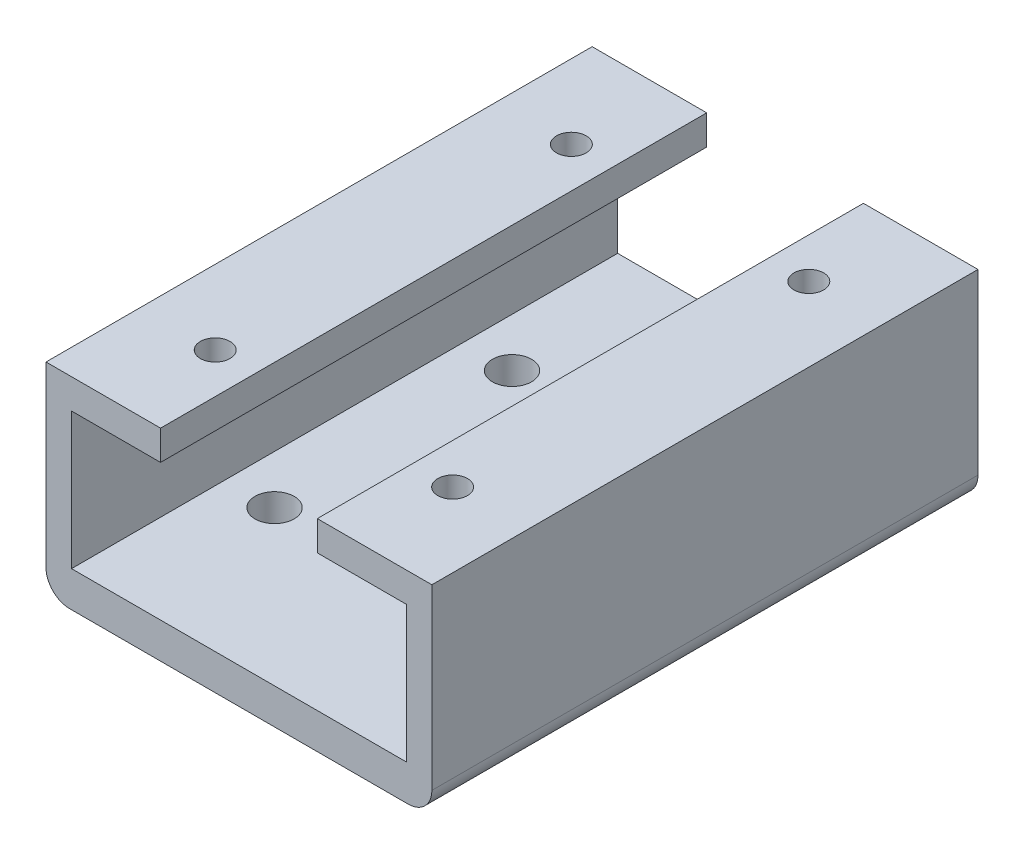
ISO-10303-21;
HEADER;
FILE_DESCRIPTION(('STEP AP214'),'2;1');
FILE_NAME('part.step','',(''),(''),'','','');
FILE_SCHEMA(('AUTOMOTIVE_DESIGN { 1 0 10303 214 1 1 1 1 }'));
ENDSEC;
DATA;
#1=APPLICATION_CONTEXT('core data for automotive mechanical design processes');
#2=APPLICATION_PROTOCOL_DEFINITION('international standard','automotive_design',2000,#1);
#3=PRODUCT_CONTEXT('',#1,'mechanical');
#4=PRODUCT('Part','Part','',(#3));
#5=PRODUCT_RELATED_PRODUCT_CATEGORY('part','',(#4));
#6=PRODUCT_DEFINITION_FORMATION('','',#4);
#7=PRODUCT_DEFINITION_CONTEXT('part definition',#1,'design');
#8=PRODUCT_DEFINITION('design','',#6,#7);
#9=PRODUCT_DEFINITION_SHAPE('','',#8);
#10=(LENGTH_UNIT() NAMED_UNIT(*) SI_UNIT(.MILLI.,.METRE.));
#11=(NAMED_UNIT(*) PLANE_ANGLE_UNIT() SI_UNIT($,.RADIAN.));
#12=(NAMED_UNIT(*) SI_UNIT($,.STERADIAN.) SOLID_ANGLE_UNIT());
#13=UNCERTAINTY_MEASURE_WITH_UNIT(LENGTH_MEASURE(1.E-05),#10,'distance_accuracy_value','');
#14=(GEOMETRIC_REPRESENTATION_CONTEXT(3) GLOBAL_UNCERTAINTY_ASSIGNED_CONTEXT((#13)) GLOBAL_UNIT_ASSIGNED_CONTEXT((#10,
#11,#12)) REPRESENTATION_CONTEXT('',''));
#15=CARTESIAN_POINT('',(0.,0.,0.));
#16=DIRECTION('',(0.,0.,1.));
#17=DIRECTION('',(1.,0.,0.));
#18=AXIS2_PLACEMENT_3D('',#15,#16,#17);
#19=CARTESIAN_POINT('',(16.25,17.,23.));
#20=DIRECTION('',(0.,0.,-1.));
#21=DIRECTION('',(-1.,0.,0.));
#22=AXIS2_PLACEMENT_3D('',#19,#20,#21);
#23=PLANE('',#22);
#24=DIRECTION('',(1.,0.,0.));
#25=VECTOR('',#24,1.);
#26=CARTESIAN_POINT('',(16.25,0.,23.));
#27=LINE('',#26,#25);
#28=CARTESIAN_POINT('',(-14.25,0.,23.));
#29=VERTEX_POINT('',#28);
#30=CARTESIAN_POINT('',(14.25,0.,23.));
#31=VERTEX_POINT('',#30);
#32=EDGE_CURVE('E198',#29,#31,#27,.T.);
#33=ORIENTED_EDGE('',*,*,#32,.T.);
#34=CARTESIAN_POINT('',(14.25,2.,23.));
#35=DIRECTION('',(0.,0.,-1.));
#36=DIRECTION('',(-1.,0.,0.));
#37=AXIS2_PLACEMENT_3D('',#34,#35,#36);
#38=CIRCLE('',#37,2.);
#39=CARTESIAN_POINT('',(16.25,2.,23.));
#40=VERTEX_POINT('',#39);
#41=EDGE_CURVE('E47',#31,#40,#38,.F.);
#42=ORIENTED_EDGE('',*,*,#41,.T.);
#43=DIRECTION('',(0.,-1.,0.));
#44=VECTOR('',#43,1.);
#45=CARTESIAN_POINT('',(16.25,17.,23.));
#46=LINE('',#45,#44);
#47=CARTESIAN_POINT('',(16.25,17.,23.));
#48=VERTEX_POINT('',#47);
#49=EDGE_CURVE('E233',#48,#40,#46,.T.);
#50=ORIENTED_EDGE('',*,*,#49,.F.);
#51=DIRECTION('',(1.,0.,0.));
#52=VECTOR('',#51,1.);
#53=CARTESIAN_POINT('',(16.25,17.,23.));
#54=LINE('',#53,#52);
#55=CARTESIAN_POINT('',(6.60000000000001,17.,23.));
#56=VERTEX_POINT('',#55);
#57=EDGE_CURVE('E166',#56,#48,#54,.T.);
#58=ORIENTED_EDGE('',*,*,#57,.F.);
#59=DIRECTION('',(0.,1.,0.));
#60=VECTOR('',#59,1.);
#61=CARTESIAN_POINT('',(6.60000000000001,0.,23.));
#62=LINE('',#61,#60);
#63=CARTESIAN_POINT('',(6.60000000000001,14.5,23.));
#64=VERTEX_POINT('',#63);
#65=EDGE_CURVE('E153',#64,#56,#62,.T.);
#66=ORIENTED_EDGE('',*,*,#65,.F.);
#67=DIRECTION('',(-1.,0.,0.));
#68=VECTOR('',#67,1.);
#69=CARTESIAN_POINT('',(0.,14.5,23.));
#70=LINE('',#69,#68);
#71=CARTESIAN_POINT('',(14.1,14.5,23.));
#72=VERTEX_POINT('',#71);
#73=EDGE_CURVE('E142',#72,#64,#70,.T.);
#74=ORIENTED_EDGE('',*,*,#73,.F.);
#75=DIRECTION('',(0.,1.,0.));
#76=VECTOR('',#75,1.);
#77=CARTESIAN_POINT('',(14.1,0.,23.));
#78=LINE('',#77,#76);
#79=CARTESIAN_POINT('',(14.1,3.,23.));
#80=VERTEX_POINT('',#79);
#81=EDGE_CURVE('E152',#80,#72,#78,.T.);
#82=ORIENTED_EDGE('',*,*,#81,.F.);
#83=DIRECTION('',(-1.,0.,0.));
#84=VECTOR('',#83,1.);
#85=CARTESIAN_POINT('',(0.,3.,23.));
#86=LINE('',#85,#84);
#87=CARTESIAN_POINT('',(-14.1,3.,23.));
#88=VERTEX_POINT('',#87);
#89=EDGE_CURVE('E176',#80,#88,#86,.T.);
#90=ORIENTED_EDGE('',*,*,#89,.T.);
#91=DIRECTION('',(0.,1.,0.));
#92=VECTOR('',#91,1.);
#93=CARTESIAN_POINT('',(-14.1,0.,23.));
#94=LINE('',#93,#92);
#95=CARTESIAN_POINT('',(-14.1,14.5,23.));
#96=VERTEX_POINT('',#95);
#97=EDGE_CURVE('E179',#88,#96,#94,.T.);
#98=ORIENTED_EDGE('',*,*,#97,.T.);
#99=CARTESIAN_POINT('',(-6.59999999999999,14.5,23.));
#100=VERTEX_POINT('',#99);
#101=EDGE_CURVE('E155',#100,#96,#70,.T.);
#102=ORIENTED_EDGE('',*,*,#101,.F.);
#103=DIRECTION('',(0.,1.,0.));
#104=VECTOR('',#103,1.);
#105=CARTESIAN_POINT('',(-6.59999999999999,0.,23.));
#106=LINE('',#105,#104);
#107=CARTESIAN_POINT('',(-6.59999999999999,17.,23.));
#108=VERTEX_POINT('',#107);
#109=EDGE_CURVE('E162',#100,#108,#106,.T.);
#110=ORIENTED_EDGE('',*,*,#109,.T.);
#111=CARTESIAN_POINT('',(-16.25,17.,23.));
#112=VERTEX_POINT('',#111);
#113=EDGE_CURVE('E215',#112,#108,#54,.T.);
#114=ORIENTED_EDGE('',*,*,#113,.F.);
#115=DIRECTION('',(0.,-1.,0.));
#116=VECTOR('',#115,1.);
#117=CARTESIAN_POINT('',(-16.25,17.,23.));
#118=LINE('',#117,#116);
#119=CARTESIAN_POINT('',(-16.25,2.,23.));
#120=VERTEX_POINT('',#119);
#121=EDGE_CURVE('E236',#112,#120,#118,.T.);
#122=ORIENTED_EDGE('',*,*,#121,.T.);
#123=CARTESIAN_POINT('',(-14.25,2.,23.));
#124=DIRECTION('',(0.,0.,-1.));
#125=DIRECTION('',(-1.,0.,0.));
#126=AXIS2_PLACEMENT_3D('',#123,#124,#125);
#127=CIRCLE('',#126,2.);
#128=EDGE_CURVE('E54',#120,#29,#127,.F.);
#129=ORIENTED_EDGE('',*,*,#128,.T.);
#130=EDGE_LOOP('',(#33,#42,#50,#58,#66,#74,#82,#90,#98,#102,#110,#114,#122,#129));
#131=FACE_BOUND('',#130,.T.);
#132=ADVANCED_FACE('F39',(#131),#23,.F.);
#133=CARTESIAN_POINT('',(16.25,17.,-23.));
#134=DIRECTION('',(0.,0.,1.));
#135=DIRECTION('',(1.,0.,0.));
#136=AXIS2_PLACEMENT_3D('',#133,#134,#135);
#137=PLANE('',#136);
#138=DIRECTION('',(0.,-1.,0.));
#139=VECTOR('',#138,1.);
#140=CARTESIAN_POINT('',(16.25,17.,-23.));
#141=LINE('',#140,#139);
#142=CARTESIAN_POINT('',(16.25,17.,-23.));
#143=VERTEX_POINT('',#142);
#144=CARTESIAN_POINT('',(16.25,2.,-23.));
#145=VERTEX_POINT('',#144);
#146=EDGE_CURVE('E230',#143,#145,#141,.T.);
#147=ORIENTED_EDGE('',*,*,#146,.T.);
#148=CARTESIAN_POINT('',(14.25,2.,-23.));
#149=DIRECTION('',(0.,0.,1.));
#150=DIRECTION('',(1.,0.,0.));
#151=AXIS2_PLACEMENT_3D('',#148,#149,#150);
#152=CIRCLE('',#151,2.);
#153=CARTESIAN_POINT('',(14.25,0.,-23.));
#154=VERTEX_POINT('',#153);
#155=EDGE_CURVE('E244',#145,#154,#152,.F.);
#156=ORIENTED_EDGE('',*,*,#155,.T.);
#157=DIRECTION('',(-1.,0.,0.));
#158=VECTOR('',#157,1.);
#159=CARTESIAN_POINT('',(16.25,0.,-23.));
#160=LINE('',#159,#158);
#161=CARTESIAN_POINT('',(-14.25,0.,-23.));
#162=VERTEX_POINT('',#161);
#163=EDGE_CURVE('E214',#154,#162,#160,.T.);
#164=ORIENTED_EDGE('',*,*,#163,.T.);
#165=CARTESIAN_POINT('',(-14.25,2.,-23.));
#166=DIRECTION('',(0.,0.,1.));
#167=DIRECTION('',(1.,0.,0.));
#168=AXIS2_PLACEMENT_3D('',#165,#166,#167);
#169=CIRCLE('',#168,2.);
#170=CARTESIAN_POINT('',(-16.25,2.,-23.));
#171=VERTEX_POINT('',#170);
#172=EDGE_CURVE('E242',#162,#171,#169,.F.);
#173=ORIENTED_EDGE('',*,*,#172,.T.);
#174=DIRECTION('',(0.,-1.,0.));
#175=VECTOR('',#174,1.);
#176=CARTESIAN_POINT('',(-16.25,17.,-23.));
#177=LINE('',#176,#175);
#178=CARTESIAN_POINT('',(-16.25,17.,-23.));
#179=VERTEX_POINT('',#178);
#180=EDGE_CURVE('E224',#179,#171,#177,.T.);
#181=ORIENTED_EDGE('',*,*,#180,.F.);
#182=DIRECTION('',(-1.,0.,0.));
#183=VECTOR('',#182,1.);
#184=CARTESIAN_POINT('',(16.25,17.,-23.));
#185=LINE('',#184,#183);
#186=CARTESIAN_POINT('',(-6.6,17.,-23.));
#187=VERTEX_POINT('',#186);
#188=EDGE_CURVE('E220',#187,#179,#185,.T.);
#189=ORIENTED_EDGE('',*,*,#188,.F.);
#190=DIRECTION('',(0.,1.,0.));
#191=VECTOR('',#190,1.);
#192=CARTESIAN_POINT('',(-6.6,0.,-23.));
#193=LINE('',#192,#191);
#194=CARTESIAN_POINT('',(-6.6,14.5,-23.));
#195=VERTEX_POINT('',#194);
#196=EDGE_CURVE('E167',#195,#187,#193,.T.);
#197=ORIENTED_EDGE('',*,*,#196,.F.);
#198=DIRECTION('',(-1.,0.,0.));
#199=VECTOR('',#198,1.);
#200=CARTESIAN_POINT('',(0.,14.5,-23.));
#201=LINE('',#200,#199);
#202=CARTESIAN_POINT('',(-14.1,14.5,-23.));
#203=VERTEX_POINT('',#202);
#204=EDGE_CURVE('E169',#195,#203,#201,.T.);
#205=ORIENTED_EDGE('',*,*,#204,.T.);
#206=DIRECTION('',(0.,1.,0.));
#207=VECTOR('',#206,1.);
#208=CARTESIAN_POINT('',(-14.1,0.,-23.));
#209=LINE('',#208,#207);
#210=CARTESIAN_POINT('',(-14.1,3.,-23.));
#211=VERTEX_POINT('',#210);
#212=EDGE_CURVE('E193',#211,#203,#209,.T.);
#213=ORIENTED_EDGE('',*,*,#212,.F.);
#214=DIRECTION('',(-1.,0.,0.));
#215=VECTOR('',#214,1.);
#216=CARTESIAN_POINT('',(0.,3.,-23.));
#217=LINE('',#216,#215);
#218=CARTESIAN_POINT('',(14.1,3.,-23.));
#219=VERTEX_POINT('',#218);
#220=EDGE_CURVE('E190',#219,#211,#217,.T.);
#221=ORIENTED_EDGE('',*,*,#220,.F.);
#222=DIRECTION('',(0.,1.,0.));
#223=VECTOR('',#222,1.);
#224=CARTESIAN_POINT('',(14.1,0.,-23.));
#225=LINE('',#224,#223);
#226=CARTESIAN_POINT('',(14.1,14.5,-23.));
#227=VERTEX_POINT('',#226);
#228=EDGE_CURVE('E187',#219,#227,#225,.T.);
#229=ORIENTED_EDGE('',*,*,#228,.T.);
#230=CARTESIAN_POINT('',(6.6,14.5,-23.));
#231=VERTEX_POINT('',#230);
#232=EDGE_CURVE('E185',#227,#231,#201,.T.);
#233=ORIENTED_EDGE('',*,*,#232,.T.);
#234=DIRECTION('',(0.,1.,0.));
#235=VECTOR('',#234,1.);
#236=CARTESIAN_POINT('',(6.6,0.,-23.));
#237=LINE('',#236,#235);
#238=CARTESIAN_POINT('',(6.6,17.,-23.));
#239=VERTEX_POINT('',#238);
#240=EDGE_CURVE('E160',#231,#239,#237,.T.);
#241=ORIENTED_EDGE('',*,*,#240,.T.);
#242=EDGE_CURVE('E221',#143,#239,#185,.T.);
#243=ORIENTED_EDGE('',*,*,#242,.F.);
#244=EDGE_LOOP('',(#147,#156,#164,#173,#181,#189,#197,#205,#213,#221,#229,#233,#241,#243));
#245=FACE_BOUND('',#244,.T.);
#246=ADVANCED_FACE('F258',(#245),#137,.F.);
#247=CARTESIAN_POINT('',(0.,17.,0.));
#248=DIRECTION('',(0.,1.,0.));
#249=DIRECTION('',(0.,0.,1.));
#250=AXIS2_PLACEMENT_3D('',#247,#248,#249);
#251=PLANE('',#250);
#252=CARTESIAN_POINT('',(10.,17.,15.));
#253=DIRECTION('',(0.,1.,0.));
#254=DIRECTION('',(0.,0.,1.));
#255=AXIS2_PLACEMENT_3D('',#252,#253,#254);
#256=CIRCLE('',#255,1.25);
#257=CARTESIAN_POINT('',(10.,17.,16.25));
#258=VERTEX_POINT('',#257);
#259=EDGE_CURVE('E426',#258,#258,#256,.T.);
#260=ORIENTED_EDGE('',*,*,#259,.F.);
#261=EDGE_LOOP('',(#260));
#262=FACE_BOUND('',#261,.T.);
#263=CARTESIAN_POINT('',(10.,17.,-15.));
#264=DIRECTION('',(0.,1.,0.));
#265=DIRECTION('',(0.,0.,1.));
#266=AXIS2_PLACEMENT_3D('',#263,#264,#265);
#267=CIRCLE('',#266,1.25);
#268=CARTESIAN_POINT('',(10.,17.,-13.75));
#269=VERTEX_POINT('',#268);
#270=EDGE_CURVE('E415',#269,#269,#267,.T.);
#271=ORIENTED_EDGE('',*,*,#270,.F.);
#272=EDGE_LOOP('',(#271));
#273=FACE_BOUND('',#272,.T.);
#274=ORIENTED_EDGE('',*,*,#242,.T.);
#275=DIRECTION('',(0.,0.,-1.));
#276=VECTOR('',#275,1.);
#277=CARTESIAN_POINT('',(6.60000000000001,17.,23.));
#278=LINE('',#277,#276);
#279=EDGE_CURVE('E196',#56,#239,#278,.T.);
#280=ORIENTED_EDGE('',*,*,#279,.F.);
#281=ORIENTED_EDGE('',*,*,#57,.T.);
#282=DIRECTION('',(0.,0.,-1.));
#283=VECTOR('',#282,1.);
#284=CARTESIAN_POINT('',(16.25,17.,23.));
#285=LINE('',#284,#283);
#286=EDGE_CURVE('E218',#48,#143,#285,.T.);
#287=ORIENTED_EDGE('',*,*,#286,.T.);
#288=EDGE_LOOP('',(#274,#280,#281,#287));
#289=FACE_BOUND('',#288,.T.);
#290=ADVANCED_FACE('F292',(#262,#273,#289),#251,.T.);
#291=CARTESIAN_POINT('',(-16.25,17.,23.));
#292=DIRECTION('',(1.,0.,0.));
#293=DIRECTION('',(0.,0.,-1.));
#294=AXIS2_PLACEMENT_3D('',#291,#292,#293);
#295=PLANE('',#294);
#296=ORIENTED_EDGE('',*,*,#180,.T.);
#297=DIRECTION('',(0.,0.,1.));
#298=VECTOR('',#297,1.);
#299=CARTESIAN_POINT('',(-16.25,2.,23.));
#300=LINE('',#299,#298);
#301=EDGE_CURVE('E11',#171,#120,#300,.T.);
#302=ORIENTED_EDGE('',*,*,#301,.T.);
#303=ORIENTED_EDGE('',*,*,#121,.F.);
#304=DIRECTION('',(0.,0.,1.));
#305=VECTOR('',#304,1.);
#306=CARTESIAN_POINT('',(-16.25,17.,23.));
#307=LINE('',#306,#305);
#308=EDGE_CURVE('E211',#179,#112,#307,.T.);
#309=ORIENTED_EDGE('',*,*,#308,.F.);
#310=EDGE_LOOP('',(#296,#302,#303,#309));
#311=FACE_BOUND('',#310,.T.);
#312=ADVANCED_FACE('F266',(#311),#295,.F.);
#313=CARTESIAN_POINT('',(16.25,17.,23.));
#314=DIRECTION('',(-1.,0.,0.));
#315=DIRECTION('',(0.,0.,1.));
#316=AXIS2_PLACEMENT_3D('',#313,#314,#315);
#317=PLANE('',#316);
#318=ORIENTED_EDGE('',*,*,#49,.T.);
#319=DIRECTION('',(0.,0.,-1.));
#320=VECTOR('',#319,1.);
#321=CARTESIAN_POINT('',(16.25,2.,23.));
#322=LINE('',#321,#320);
#323=EDGE_CURVE('E239',#40,#145,#322,.T.);
#324=ORIENTED_EDGE('',*,*,#323,.T.);
#325=ORIENTED_EDGE('',*,*,#146,.F.);
#326=ORIENTED_EDGE('',*,*,#286,.F.);
#327=EDGE_LOOP('',(#318,#324,#325,#326));
#328=FACE_BOUND('',#327,.T.);
#329=ADVANCED_FACE('F254',(#328),#317,.F.);
#330=CARTESIAN_POINT('',(-10.,17.,15.));
#331=DIRECTION('',(0.,1.,0.));
#332=DIRECTION('',(0.,0.,1.));
#333=AXIS2_PLACEMENT_3D('',#330,#331,#332);
#334=CIRCLE('',#333,1.25);
#335=CARTESIAN_POINT('',(-10.,17.,16.25));
#336=VERTEX_POINT('',#335);
#337=EDGE_CURVE('E421',#336,#336,#334,.T.);
#338=ORIENTED_EDGE('',*,*,#337,.F.);
#339=EDGE_LOOP('',(#338));
#340=FACE_BOUND('',#339,.T.);
#341=CARTESIAN_POINT('',(-10.,17.,-15.));
#342=DIRECTION('',(0.,1.,0.));
#343=DIRECTION('',(0.,0.,1.));
#344=AXIS2_PLACEMENT_3D('',#341,#342,#343);
#345=CIRCLE('',#344,1.25);
#346=CARTESIAN_POINT('',(-10.,17.,-13.75));
#347=VERTEX_POINT('',#346);
#348=EDGE_CURVE('E412',#347,#347,#345,.T.);
#349=ORIENTED_EDGE('',*,*,#348,.F.);
#350=EDGE_LOOP('',(#349));
#351=FACE_BOUND('',#350,.T.);
#352=DIRECTION('',(0.,0.,-1.));
#353=VECTOR('',#352,1.);
#354=CARTESIAN_POINT('',(-6.59999999999999,17.,23.));
#355=LINE('',#354,#353);
#356=EDGE_CURVE('E199',#108,#187,#355,.T.);
#357=ORIENTED_EDGE('',*,*,#356,.T.);
#358=ORIENTED_EDGE('',*,*,#188,.T.);
#359=ORIENTED_EDGE('',*,*,#308,.T.);
#360=ORIENTED_EDGE('',*,*,#113,.T.);
#361=EDGE_LOOP('',(#357,#358,#359,#360));
#362=FACE_BOUND('',#361,.T.);
#363=ADVANCED_FACE('F269',(#340,#351,#362),#251,.T.);
#364=CARTESIAN_POINT('',(0.,0.,0.));
#365=DIRECTION('',(0.,1.,0.));
#366=DIRECTION('',(0.,0.,1.));
#367=AXIS2_PLACEMENT_3D('',#364,#365,#366);
#368=PLANE('',#367);
#369=CARTESIAN_POINT('',(-10.,0.,-10.));
#370=DIRECTION('',(0.,-1.,0.));
#371=DIRECTION('',(0.,0.,-1.));
#372=AXIS2_PLACEMENT_3D('',#369,#370,#371);
#373=CIRCLE('',#372,1.65);
#374=CARTESIAN_POINT('',(-10.,0.,-11.65));
#375=VERTEX_POINT('',#374);
#376=EDGE_CURVE('E385',#375,#375,#373,.T.);
#377=ORIENTED_EDGE('',*,*,#376,.F.);
#378=EDGE_LOOP('',(#377));
#379=FACE_BOUND('',#378,.T.);
#380=CARTESIAN_POINT('',(10.,0.,-10.));
#381=DIRECTION('',(0.,-1.,0.));
#382=DIRECTION('',(0.,0.,-1.));
#383=AXIS2_PLACEMENT_3D('',#380,#381,#382);
#384=CIRCLE('',#383,1.65);
#385=CARTESIAN_POINT('',(10.,0.,-11.65));
#386=VERTEX_POINT('',#385);
#387=EDGE_CURVE('E389',#386,#386,#384,.T.);
#388=ORIENTED_EDGE('',*,*,#387,.F.);
#389=EDGE_LOOP('',(#388));
#390=FACE_BOUND('',#389,.T.);
#391=CARTESIAN_POINT('',(10.,0.,10.));
#392=DIRECTION('',(0.,-1.,0.));
#393=DIRECTION('',(0.,0.,-1.));
#394=AXIS2_PLACEMENT_3D('',#391,#392,#393);
#395=CIRCLE('',#394,1.65);
#396=CARTESIAN_POINT('',(10.,0.,8.35));
#397=VERTEX_POINT('',#396);
#398=EDGE_CURVE('E393',#397,#397,#395,.T.);
#399=ORIENTED_EDGE('',*,*,#398,.F.);
#400=EDGE_LOOP('',(#399));
#401=FACE_BOUND('',#400,.T.);
#402=CARTESIAN_POINT('',(-10.,0.,10.));
#403=DIRECTION('',(0.,-1.,0.));
#404=DIRECTION('',(0.,0.,-1.));
#405=AXIS2_PLACEMENT_3D('',#402,#403,#404);
#406=CIRCLE('',#405,1.65);
#407=CARTESIAN_POINT('',(-10.,0.,8.35));
#408=VERTEX_POINT('',#407);
#409=EDGE_CURVE('E396',#408,#408,#406,.T.);
#410=ORIENTED_EDGE('',*,*,#409,.F.);
#411=EDGE_LOOP('',(#410));
#412=FACE_BOUND('',#411,.T.);
#413=ORIENTED_EDGE('',*,*,#163,.F.);
#414=DIRECTION('',(0.,0.,-1.));
#415=VECTOR('',#414,1.);
#416=CARTESIAN_POINT('',(14.25,0.,0.));
#417=LINE('',#416,#415);
#418=EDGE_CURVE('E61',#154,#31,#417,.F.);
#419=ORIENTED_EDGE('',*,*,#418,.T.);
#420=ORIENTED_EDGE('',*,*,#32,.F.);
#421=DIRECTION('',(0.,0.,1.));
#422=VECTOR('',#421,1.);
#423=CARTESIAN_POINT('',(-14.25,0.,0.));
#424=LINE('',#423,#422);
#425=EDGE_CURVE('E246',#29,#162,#424,.F.);
#426=ORIENTED_EDGE('',*,*,#425,.T.);
#427=EDGE_LOOP('',(#413,#419,#420,#426));
#428=FACE_BOUND('',#427,.T.);
#429=ADVANCED_FACE('F261',(#379,#390,#401,#412,#428),#368,.F.);
#430=CARTESIAN_POINT('',(6.60000000000001,0.,23.));
#431=DIRECTION('',(-1.,0.,0.));
#432=DIRECTION('',(0.,0.,1.));
#433=AXIS2_PLACEMENT_3D('',#430,#431,#432);
#434=PLANE('',#433);
#435=ORIENTED_EDGE('',*,*,#240,.F.);
#436=DIRECTION('',(0.,0.,-1.));
#437=VECTOR('',#436,1.);
#438=CARTESIAN_POINT('',(6.60000000000001,14.5,23.));
#439=LINE('',#438,#437);
#440=EDGE_CURVE('E146',#64,#231,#439,.T.);
#441=ORIENTED_EDGE('',*,*,#440,.F.);
#442=ORIENTED_EDGE('',*,*,#65,.T.);
#443=ORIENTED_EDGE('',*,*,#279,.T.);
#444=EDGE_LOOP('',(#435,#441,#442,#443));
#445=FACE_BOUND('',#444,.T.);
#446=ADVANCED_FACE('F157',(#445),#434,.T.);
#447=CARTESIAN_POINT('',(-6.59999999999999,0.,23.));
#448=DIRECTION('',(-1.,0.,0.));
#449=DIRECTION('',(0.,0.,1.));
#450=AXIS2_PLACEMENT_3D('',#447,#448,#449);
#451=PLANE('',#450);
#452=ORIENTED_EDGE('',*,*,#196,.T.);
#453=ORIENTED_EDGE('',*,*,#356,.F.);
#454=ORIENTED_EDGE('',*,*,#109,.F.);
#455=DIRECTION('',(0.,0.,-1.));
#456=VECTOR('',#455,1.);
#457=CARTESIAN_POINT('',(-6.59999999999999,14.5,23.));
#458=LINE('',#457,#456);
#459=EDGE_CURVE('E202',#100,#195,#458,.T.);
#460=ORIENTED_EDGE('',*,*,#459,.T.);
#461=EDGE_LOOP('',(#452,#453,#454,#460));
#462=FACE_BOUND('',#461,.T.);
#463=ADVANCED_FACE('F275',(#462),#451,.F.);
#464=CARTESIAN_POINT('',(0.,14.5,23.));
#465=DIRECTION('',(0.,-1.,0.));
#466=DIRECTION('',(0.,0.,-1.));
#467=AXIS2_PLACEMENT_3D('',#464,#465,#466);
#468=PLANE('',#467);
#469=ORIENTED_EDGE('',*,*,#204,.F.);
#470=ORIENTED_EDGE('',*,*,#459,.F.);
#471=ORIENTED_EDGE('',*,*,#101,.T.);
#472=DIRECTION('',(0.,0.,-1.));
#473=VECTOR('',#472,1.);
#474=CARTESIAN_POINT('',(-14.1,14.5,23.));
#475=LINE('',#474,#473);
#476=EDGE_CURVE('E204',#96,#203,#475,.T.);
#477=ORIENTED_EDGE('',*,*,#476,.T.);
#478=EDGE_LOOP('',(#469,#470,#471,#477));
#479=FACE_BOUND('',#478,.T.);
#480=ADVANCED_FACE('F279',(#479),#468,.T.);
#481=CARTESIAN_POINT('',(-14.1,0.,23.));
#482=DIRECTION('',(-1.,0.,0.));
#483=DIRECTION('',(0.,0.,1.));
#484=AXIS2_PLACEMENT_3D('',#481,#482,#483);
#485=PLANE('',#484);
#486=ORIENTED_EDGE('',*,*,#212,.T.);
#487=ORIENTED_EDGE('',*,*,#476,.F.);
#488=ORIENTED_EDGE('',*,*,#97,.F.);
#489=DIRECTION('',(0.,0.,-1.));
#490=VECTOR('',#489,1.);
#491=CARTESIAN_POINT('',(-14.1,3.,23.));
#492=LINE('',#491,#490);
#493=EDGE_CURVE('E206',#88,#211,#492,.T.);
#494=ORIENTED_EDGE('',*,*,#493,.T.);
#495=EDGE_LOOP('',(#486,#487,#488,#494));
#496=FACE_BOUND('',#495,.T.);
#497=ADVANCED_FACE('F283',(#496),#485,.F.);
#498=CARTESIAN_POINT('',(0.,3.,23.));
#499=DIRECTION('',(0.,-1.,0.));
#500=DIRECTION('',(0.,0.,-1.));
#501=AXIS2_PLACEMENT_3D('',#498,#499,#500);
#502=PLANE('',#501);
#503=CARTESIAN_POINT('',(-10.,3.,-10.));
#504=DIRECTION('',(0.,-1.,0.));
#505=DIRECTION('',(0.,0.,-1.));
#506=AXIS2_PLACEMENT_3D('',#503,#504,#505);
#507=CIRCLE('',#506,1.65);
#508=CARTESIAN_POINT('',(-10.,3.,-11.65));
#509=VERTEX_POINT('',#508);
#510=EDGE_CURVE('E403',#509,#509,#507,.F.);
#511=ORIENTED_EDGE('',*,*,#510,.F.);
#512=EDGE_LOOP('',(#511));
#513=FACE_BOUND('',#512,.T.);
#514=CARTESIAN_POINT('',(10.,3.,-10.));
#515=DIRECTION('',(0.,-1.,0.));
#516=DIRECTION('',(0.,0.,-1.));
#517=AXIS2_PLACEMENT_3D('',#514,#515,#516);
#518=CIRCLE('',#517,1.65);
#519=CARTESIAN_POINT('',(10.,3.,-11.65));
#520=VERTEX_POINT('',#519);
#521=EDGE_CURVE('E402',#520,#520,#518,.F.);
#522=ORIENTED_EDGE('',*,*,#521,.F.);
#523=EDGE_LOOP('',(#522));
#524=FACE_BOUND('',#523,.T.);
#525=CARTESIAN_POINT('',(10.,3.,10.));
#526=DIRECTION('',(0.,-1.,0.));
#527=DIRECTION('',(0.,0.,-1.));
#528=AXIS2_PLACEMENT_3D('',#525,#526,#527);
#529=CIRCLE('',#528,1.65);
#530=CARTESIAN_POINT('',(10.,3.,8.35));
#531=VERTEX_POINT('',#530);
#532=EDGE_CURVE('E398',#531,#531,#529,.F.);
#533=ORIENTED_EDGE('',*,*,#532,.F.);
#534=EDGE_LOOP('',(#533));
#535=FACE_BOUND('',#534,.T.);
#536=CARTESIAN_POINT('',(-10.,3.,10.));
#537=DIRECTION('',(0.,-1.,0.));
#538=DIRECTION('',(0.,0.,-1.));
#539=AXIS2_PLACEMENT_3D('',#536,#537,#538);
#540=CIRCLE('',#539,1.65);
#541=CARTESIAN_POINT('',(-10.,3.,8.35));
#542=VERTEX_POINT('',#541);
#543=EDGE_CURVE('E172',#542,#542,#540,.F.);
#544=ORIENTED_EDGE('',*,*,#543,.F.);
#545=EDGE_LOOP('',(#544));
#546=FACE_BOUND('',#545,.T.);
#547=ORIENTED_EDGE('',*,*,#220,.T.);
#548=ORIENTED_EDGE('',*,*,#493,.F.);
#549=ORIENTED_EDGE('',*,*,#89,.F.);
#550=DIRECTION('',(0.,0.,-1.));
#551=VECTOR('',#550,1.);
#552=CARTESIAN_POINT('',(14.1,3.,23.));
#553=LINE('',#552,#551);
#554=EDGE_CURVE('E208',#80,#219,#553,.T.);
#555=ORIENTED_EDGE('',*,*,#554,.T.);
#556=EDGE_LOOP('',(#547,#548,#549,#555));
#557=FACE_BOUND('',#556,.T.);
#558=ADVANCED_FACE('F287',(#513,#524,#535,#546,#557),#502,.F.);
#559=CARTESIAN_POINT('',(14.1,0.,23.));
#560=DIRECTION('',(-1.,0.,0.));
#561=DIRECTION('',(0.,0.,1.));
#562=AXIS2_PLACEMENT_3D('',#559,#560,#561);
#563=PLANE('',#562);
#564=ORIENTED_EDGE('',*,*,#228,.F.);
#565=ORIENTED_EDGE('',*,*,#554,.F.);
#566=ORIENTED_EDGE('',*,*,#81,.T.);
#567=DIRECTION('',(0.,0.,-1.));
#568=VECTOR('',#567,1.);
#569=CARTESIAN_POINT('',(14.1,14.5,23.));
#570=LINE('',#569,#568);
#571=EDGE_CURVE('E148',#72,#227,#570,.T.);
#572=ORIENTED_EDGE('',*,*,#571,.T.);
#573=EDGE_LOOP('',(#564,#565,#566,#572));
#574=FACE_BOUND('',#573,.T.);
#575=ADVANCED_FACE('F290',(#574),#563,.T.);
#576=ORIENTED_EDGE('',*,*,#232,.F.);
#577=ORIENTED_EDGE('',*,*,#571,.F.);
#578=ORIENTED_EDGE('',*,*,#73,.T.);
#579=ORIENTED_EDGE('',*,*,#440,.T.);
#580=EDGE_LOOP('',(#576,#577,#578,#579));
#581=FACE_BOUND('',#580,.T.);
#582=ADVANCED_FACE('F145',(#581),#468,.T.);
#583=CARTESIAN_POINT('',(-10.,17.001,10.));
#584=DIRECTION('',(0.,-1.,0.));
#585=DIRECTION('',(0.,0.,-1.));
#586=AXIS2_PLACEMENT_3D('',#583,#584,#585);
#587=CYLINDRICAL_SURFACE('',#586,1.65);
#588=ORIENTED_EDGE('',*,*,#409,.T.);
#589=EDGE_LOOP('',(#588));
#590=FACE_BOUND('',#589,.T.);
#591=ORIENTED_EDGE('',*,*,#543,.T.);
#592=EDGE_LOOP('',(#591));
#593=FACE_BOUND('',#592,.T.);
#594=ADVANCED_FACE('F355',(#590,#593),#587,.F.);
#595=CARTESIAN_POINT('',(10.,17.001,10.));
#596=DIRECTION('',(0.,-1.,0.));
#597=DIRECTION('',(0.,0.,-1.));
#598=AXIS2_PLACEMENT_3D('',#595,#596,#597);
#599=CYLINDRICAL_SURFACE('',#598,1.65);
#600=ORIENTED_EDGE('',*,*,#398,.T.);
#601=EDGE_LOOP('',(#600));
#602=FACE_BOUND('',#601,.T.);
#603=ORIENTED_EDGE('',*,*,#532,.T.);
#604=EDGE_LOOP('',(#603));
#605=FACE_BOUND('',#604,.T.);
#606=ADVANCED_FACE('F351',(#602,#605),#599,.F.);
#607=CARTESIAN_POINT('',(10.,17.001,-10.));
#608=DIRECTION('',(0.,-1.,0.));
#609=DIRECTION('',(0.,0.,-1.));
#610=AXIS2_PLACEMENT_3D('',#607,#608,#609);
#611=CYLINDRICAL_SURFACE('',#610,1.65);
#612=ORIENTED_EDGE('',*,*,#387,.T.);
#613=EDGE_LOOP('',(#612));
#614=FACE_BOUND('',#613,.T.);
#615=ORIENTED_EDGE('',*,*,#521,.T.);
#616=EDGE_LOOP('',(#615));
#617=FACE_BOUND('',#616,.T.);
#618=ADVANCED_FACE('F354',(#614,#617),#611,.F.);
#619=CARTESIAN_POINT('',(-10.,17.001,-10.));
#620=DIRECTION('',(0.,-1.,0.));
#621=DIRECTION('',(0.,0.,-1.));
#622=AXIS2_PLACEMENT_3D('',#619,#620,#621);
#623=CYLINDRICAL_SURFACE('',#622,1.65);
#624=ORIENTED_EDGE('',*,*,#376,.T.);
#625=EDGE_LOOP('',(#624));
#626=FACE_BOUND('',#625,.T.);
#627=ORIENTED_EDGE('',*,*,#510,.T.);
#628=EDGE_LOOP('',(#627));
#629=FACE_BOUND('',#628,.T.);
#630=ADVANCED_FACE('F349',(#626,#629),#623,.F.);
#631=CARTESIAN_POINT('',(-10.,15.,-15.));
#632=DIRECTION('',(0.,1.,0.));
#633=DIRECTION('',(0.,0.,1.));
#634=AXIS2_PLACEMENT_3D('',#631,#632,#633);
#635=CYLINDRICAL_SURFACE('',#634,1.25);
#636=CARTESIAN_POINT('',(-10.,15.,-15.));
#637=DIRECTION('',(0.,1.,0.));
#638=DIRECTION('',(0.,0.,1.));
#639=AXIS2_PLACEMENT_3D('',#636,#637,#638);
#640=CIRCLE('',#639,1.25);
#641=CARTESIAN_POINT('',(-10.,15.,-13.75));
#642=VERTEX_POINT('',#641);
#643=EDGE_CURVE('E406',#642,#642,#640,.T.);
#644=ORIENTED_EDGE('',*,*,#643,.F.);
#645=EDGE_LOOP('',(#644));
#646=FACE_BOUND('',#645,.T.);
#647=ORIENTED_EDGE('',*,*,#348,.T.);
#648=EDGE_LOOP('',(#647));
#649=FACE_BOUND('',#648,.T.);
#650=ADVANCED_FACE('F345',(#646,#649),#635,.F.);
#651=CARTESIAN_POINT('',(-10.,15.,-15.));
#652=DIRECTION('',(0.,1.,0.));
#653=DIRECTION('',(0.,0.,1.));
#654=AXIS2_PLACEMENT_3D('',#651,#652,#653);
#655=PLANE('',#654);
#656=ORIENTED_EDGE('',*,*,#643,.T.);
#657=EDGE_LOOP('',(#656));
#658=FACE_BOUND('',#657,.T.);
#659=ADVANCED_FACE('F337',(#658),#655,.T.);
#660=CARTESIAN_POINT('',(-10.,15.,15.));
#661=DIRECTION('',(0.,1.,0.));
#662=DIRECTION('',(0.,0.,1.));
#663=AXIS2_PLACEMENT_3D('',#660,#661,#662);
#664=CYLINDRICAL_SURFACE('',#663,1.25);
#665=CARTESIAN_POINT('',(-10.,15.,15.));
#666=DIRECTION('',(0.,1.,0.));
#667=DIRECTION('',(0.,0.,1.));
#668=AXIS2_PLACEMENT_3D('',#665,#666,#667);
#669=CIRCLE('',#668,1.25);
#670=CARTESIAN_POINT('',(-10.,15.,16.25));
#671=VERTEX_POINT('',#670);
#672=EDGE_CURVE('E418',#671,#671,#669,.T.);
#673=ORIENTED_EDGE('',*,*,#672,.F.);
#674=EDGE_LOOP('',(#673));
#675=FACE_BOUND('',#674,.T.);
#676=ORIENTED_EDGE('',*,*,#337,.T.);
#677=EDGE_LOOP('',(#676));
#678=FACE_BOUND('',#677,.T.);
#679=ADVANCED_FACE('F333',(#675,#678),#664,.F.);
#680=CARTESIAN_POINT('',(-10.,15.,15.));
#681=DIRECTION('',(0.,1.,0.));
#682=DIRECTION('',(0.,0.,1.));
#683=AXIS2_PLACEMENT_3D('',#680,#681,#682);
#684=PLANE('',#683);
#685=ORIENTED_EDGE('',*,*,#672,.T.);
#686=EDGE_LOOP('',(#685));
#687=FACE_BOUND('',#686,.T.);
#688=ADVANCED_FACE('F336',(#687),#684,.T.);
#689=CARTESIAN_POINT('',(10.,15.,-15.));
#690=DIRECTION('',(0.,1.,0.));
#691=DIRECTION('',(0.,0.,1.));
#692=AXIS2_PLACEMENT_3D('',#689,#690,#691);
#693=CYLINDRICAL_SURFACE('',#692,1.25);
#694=CARTESIAN_POINT('',(10.,15.,-15.));
#695=DIRECTION('',(0.,1.,0.));
#696=DIRECTION('',(0.,0.,1.));
#697=AXIS2_PLACEMENT_3D('',#694,#695,#696);
#698=CIRCLE('',#697,1.25);
#699=CARTESIAN_POINT('',(10.,15.,-13.75));
#700=VERTEX_POINT('',#699);
#701=EDGE_CURVE('E429',#700,#700,#698,.T.);
#702=ORIENTED_EDGE('',*,*,#701,.F.);
#703=EDGE_LOOP('',(#702));
#704=FACE_BOUND('',#703,.T.);
#705=ORIENTED_EDGE('',*,*,#270,.T.);
#706=EDGE_LOOP('',(#705));
#707=FACE_BOUND('',#706,.T.);
#708=ADVANCED_FACE('F341',(#704,#707),#693,.F.);
#709=CARTESIAN_POINT('',(10.,15.,-15.));
#710=DIRECTION('',(0.,1.,0.));
#711=DIRECTION('',(0.,0.,1.));
#712=AXIS2_PLACEMENT_3D('',#709,#710,#711);
#713=PLANE('',#712);
#714=ORIENTED_EDGE('',*,*,#701,.T.);
#715=EDGE_LOOP('',(#714));
#716=FACE_BOUND('',#715,.T.);
#717=ADVANCED_FACE('F327',(#716),#713,.T.);
#718=CARTESIAN_POINT('',(10.,15.,15.));
#719=DIRECTION('',(0.,1.,0.));
#720=DIRECTION('',(0.,0.,1.));
#721=AXIS2_PLACEMENT_3D('',#718,#719,#720);
#722=CYLINDRICAL_SURFACE('',#721,1.25);
#723=CARTESIAN_POINT('',(10.,15.,15.));
#724=DIRECTION('',(0.,1.,0.));
#725=DIRECTION('',(0.,0.,1.));
#726=AXIS2_PLACEMENT_3D('',#723,#724,#725);
#727=CIRCLE('',#726,1.25);
#728=CARTESIAN_POINT('',(10.,15.,16.25));
#729=VERTEX_POINT('',#728);
#730=EDGE_CURVE('E424',#729,#729,#727,.T.);
#731=ORIENTED_EDGE('',*,*,#730,.F.);
#732=EDGE_LOOP('',(#731));
#733=FACE_BOUND('',#732,.T.);
#734=ORIENTED_EDGE('',*,*,#259,.T.);
#735=EDGE_LOOP('',(#734));
#736=FACE_BOUND('',#735,.T.);
#737=ADVANCED_FACE('F321',(#733,#736),#722,.F.);
#738=CARTESIAN_POINT('',(10.,15.,15.));
#739=DIRECTION('',(0.,1.,0.));
#740=DIRECTION('',(0.,0.,1.));
#741=AXIS2_PLACEMENT_3D('',#738,#739,#740);
#742=PLANE('',#741);
#743=ORIENTED_EDGE('',*,*,#730,.T.);
#744=EDGE_LOOP('',(#743));
#745=FACE_BOUND('',#744,.T.);
#746=ADVANCED_FACE('F316',(#745),#742,.T.);
#747=CARTESIAN_POINT('',(14.25,2.,23.));
#748=DIRECTION('',(0.,0.,-1.));
#749=DIRECTION('',(-1.,0.,0.));
#750=AXIS2_PLACEMENT_3D('',#747,#748,#749);
#751=CYLINDRICAL_SURFACE('',#750,2.);
#752=ORIENTED_EDGE('',*,*,#41,.F.);
#753=ORIENTED_EDGE('',*,*,#418,.F.);
#754=ORIENTED_EDGE('',*,*,#155,.F.);
#755=ORIENTED_EDGE('',*,*,#323,.F.);
#756=EDGE_LOOP('',(#752,#753,#754,#755));
#757=FACE_BOUND('',#756,.T.);
#758=ADVANCED_FACE('F256',(#757),#751,.T.);
#759=CARTESIAN_POINT('',(-14.25,2.,23.));
#760=DIRECTION('',(0.,0.,1.));
#761=DIRECTION('',(1.,0.,0.));
#762=AXIS2_PLACEMENT_3D('',#759,#760,#761);
#763=CYLINDRICAL_SURFACE('',#762,2.);
#764=ORIENTED_EDGE('',*,*,#172,.F.);
#765=ORIENTED_EDGE('',*,*,#425,.F.);
#766=ORIENTED_EDGE('',*,*,#128,.F.);
#767=ORIENTED_EDGE('',*,*,#301,.F.);
#768=EDGE_LOOP('',(#764,#765,#766,#767));
#769=FACE_BOUND('',#768,.T.);
#770=ADVANCED_FACE('F41',(#769),#763,.T.);
#771=CLOSED_SHELL('',(#132,#246,#290,#312,#329,#363,#429,#446,#463,#480,#497,#558,#575,#582,
#594,#606,#618,#630,#650,#659,#679,#688,#708,#717,#737,#746,#758,#770));
#772=MANIFOLD_SOLID_BREP('B2',#771);
#773=ADVANCED_BREP_SHAPE_REPRESENTATION('',(#18,#772),#14);
#774=SHAPE_DEFINITION_REPRESENTATION(#9,#773);
ENDSEC;
END-ISO-10303-21;
